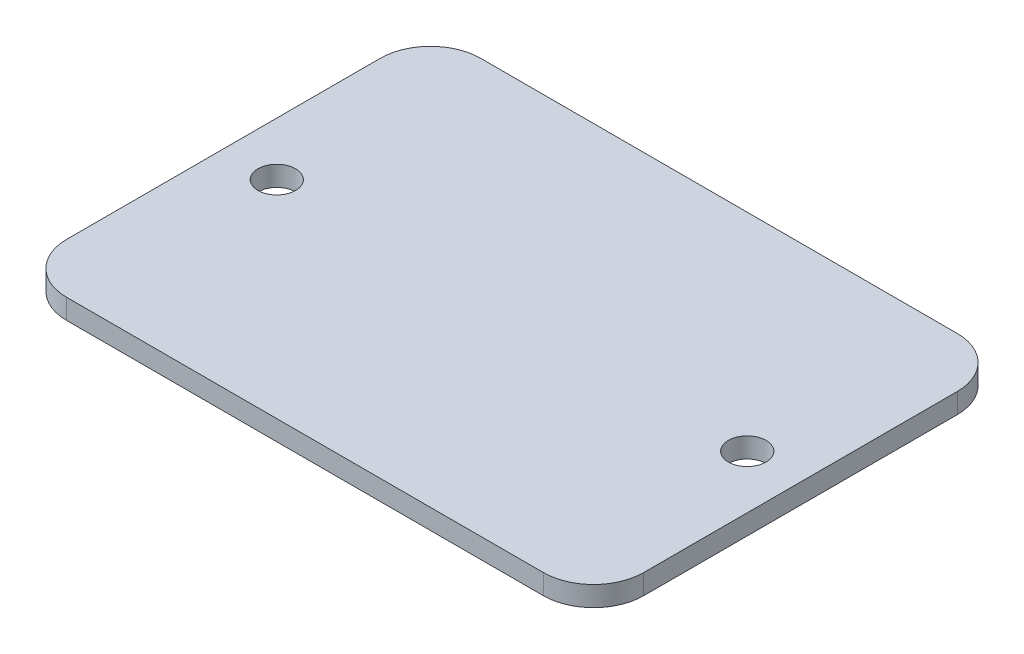
ISO-10303-21;
HEADER;
FILE_DESCRIPTION(('STEP AP214'),'2;1');
FILE_NAME('part.step','',(''),(''),'','','');
FILE_SCHEMA(('AUTOMOTIVE_DESIGN { 1 0 10303 214 1 1 1 1 }'));
ENDSEC;
DATA;
#1=APPLICATION_CONTEXT('core data for automotive mechanical design processes');
#2=APPLICATION_PROTOCOL_DEFINITION('international standard','automotive_design',2000,#1);
#3=PRODUCT_CONTEXT('',#1,'mechanical');
#4=PRODUCT('Part','Part','',(#3));
#5=PRODUCT_RELATED_PRODUCT_CATEGORY('part','',(#4));
#6=PRODUCT_DEFINITION_FORMATION('','',#4);
#7=PRODUCT_DEFINITION_CONTEXT('part definition',#1,'design');
#8=PRODUCT_DEFINITION('design','',#6,#7);
#9=PRODUCT_DEFINITION_SHAPE('','',#8);
#10=(LENGTH_UNIT() NAMED_UNIT(*) SI_UNIT(.MILLI.,.METRE.));
#11=(NAMED_UNIT(*) PLANE_ANGLE_UNIT() SI_UNIT($,.RADIAN.));
#12=(NAMED_UNIT(*) SI_UNIT($,.STERADIAN.) SOLID_ANGLE_UNIT());
#13=UNCERTAINTY_MEASURE_WITH_UNIT(LENGTH_MEASURE(1.E-05),#10,'distance_accuracy_value','');
#14=(GEOMETRIC_REPRESENTATION_CONTEXT(3) GLOBAL_UNCERTAINTY_ASSIGNED_CONTEXT((#13)) GLOBAL_UNIT_ASSIGNED_CONTEXT((#10,
#11,#12)) REPRESENTATION_CONTEXT('',''));
#15=CARTESIAN_POINT('',(0.,0.,0.));
#16=DIRECTION('',(0.,0.,1.));
#17=DIRECTION('',(1.,0.,0.));
#18=AXIS2_PLACEMENT_3D('',#15,#16,#17);
#19=CARTESIAN_POINT('',(0.,1.6,0.));
#20=DIRECTION('',(0.,-1.,0.));
#21=DIRECTION('',(0.,0.,-1.));
#22=AXIS2_PLACEMENT_3D('',#19,#20,#21);
#23=PLANE('',#22);
#24=DIRECTION('',(-1.,0.,0.));
#25=VECTOR('',#24,1.);
#26=CARTESIAN_POINT('',(-23.,1.6,-16.5));
#27=LINE('',#26,#25);
#28=CARTESIAN_POINT('',(19.,1.6,-16.5));
#29=VERTEX_POINT('',#28);
#30=CARTESIAN_POINT('',(-19.,1.6,-16.5));
#31=VERTEX_POINT('',#30);
#32=EDGE_CURVE('E201',#29,#31,#27,.T.);
#33=ORIENTED_EDGE('',*,*,#32,.T.);
#34=CARTESIAN_POINT('',(-19.,1.6,-12.5));
#35=DIRECTION('',(0.,-1.,0.));
#36=DIRECTION('',(0.,0.,-1.));
#37=AXIS2_PLACEMENT_3D('',#34,#35,#36);
#38=CIRCLE('',#37,4.);
#39=CARTESIAN_POINT('',(-23.,1.6,-12.5));
#40=VERTEX_POINT('',#39);
#41=EDGE_CURVE('E174',#31,#40,#38,.F.);
#42=ORIENTED_EDGE('',*,*,#41,.T.);
#43=DIRECTION('',(0.,0.,1.));
#44=VECTOR('',#43,1.);
#45=CARTESIAN_POINT('',(-23.,1.6,16.5));
#46=LINE('',#45,#44);
#47=CARTESIAN_POINT('',(-23.,1.6,12.5));
#48=VERTEX_POINT('',#47);
#49=EDGE_CURVE('E131',#40,#48,#46,.T.);
#50=ORIENTED_EDGE('',*,*,#49,.T.);
#51=CARTESIAN_POINT('',(-19.,1.6,12.5));
#52=DIRECTION('',(0.,-1.,0.));
#53=DIRECTION('',(0.,0.,-1.));
#54=AXIS2_PLACEMENT_3D('',#51,#52,#53);
#55=CIRCLE('',#54,4.);
#56=CARTESIAN_POINT('',(-19.,1.6,16.5));
#57=VERTEX_POINT('',#56);
#58=EDGE_CURVE('E66',#48,#57,#55,.F.);
#59=ORIENTED_EDGE('',*,*,#58,.T.);
#60=DIRECTION('',(1.,0.,0.));
#61=VECTOR('',#60,1.);
#62=CARTESIAN_POINT('',(-23.,1.6,16.5));
#63=LINE('',#62,#61);
#64=CARTESIAN_POINT('',(19.,1.6,16.5));
#65=VERTEX_POINT('',#64);
#66=EDGE_CURVE('E152',#57,#65,#63,.T.);
#67=ORIENTED_EDGE('',*,*,#66,.T.);
#68=CARTESIAN_POINT('',(19.,1.6,12.5));
#69=DIRECTION('',(0.,-1.,0.));
#70=DIRECTION('',(0.,0.,-1.));
#71=AXIS2_PLACEMENT_3D('',#68,#69,#70);
#72=CIRCLE('',#71,4.);
#73=CARTESIAN_POINT('',(23.,1.6,12.5));
#74=VERTEX_POINT('',#73);
#75=EDGE_CURVE('E168',#65,#74,#72,.F.);
#76=ORIENTED_EDGE('',*,*,#75,.T.);
#77=DIRECTION('',(0.,0.,-1.));
#78=VECTOR('',#77,1.);
#79=CARTESIAN_POINT('',(23.,1.6,16.5));
#80=LINE('',#79,#78);
#81=CARTESIAN_POINT('',(23.,1.6,-12.5));
#82=VERTEX_POINT('',#81);
#83=EDGE_CURVE('E145',#74,#82,#80,.T.);
#84=ORIENTED_EDGE('',*,*,#83,.T.);
#85=CARTESIAN_POINT('',(19.,1.6,-12.5));
#86=DIRECTION('',(0.,-1.,0.));
#87=DIRECTION('',(0.,0.,-1.));
#88=AXIS2_PLACEMENT_3D('',#85,#86,#87);
#89=CIRCLE('',#88,4.);
#90=EDGE_CURVE('E171',#82,#29,#89,.F.);
#91=ORIENTED_EDGE('',*,*,#90,.T.);
#92=EDGE_LOOP('',(#33,#42,#50,#59,#67,#76,#84,#91));
#93=FACE_BOUND('',#92,.T.);
#94=CARTESIAN_POINT('',(-18.75,1.6,0.));
#95=DIRECTION('',(0.,1.,0.));
#96=DIRECTION('',(0.,0.,1.));
#97=AXIS2_PLACEMENT_3D('',#94,#95,#96);
#98=CIRCLE('',#97,1.5);
#99=CARTESIAN_POINT('',(-18.75,1.6,1.5));
#100=VERTEX_POINT('',#99);
#101=EDGE_CURVE('E214',#100,#100,#98,.T.);
#102=ORIENTED_EDGE('',*,*,#101,.F.);
#103=EDGE_LOOP('',(#102));
#104=FACE_BOUND('',#103,.T.);
#105=CARTESIAN_POINT('',(18.75,1.6,0.));
#106=DIRECTION('',(0.,1.,0.));
#107=DIRECTION('',(0.,0.,-1.));
#108=AXIS2_PLACEMENT_3D('',#105,#106,#107);
#109=CIRCLE('',#108,1.5);
#110=CARTESIAN_POINT('',(18.75,1.6,-1.5));
#111=VERTEX_POINT('',#110);
#112=EDGE_CURVE('E221',#111,#111,#109,.T.);
#113=ORIENTED_EDGE('',*,*,#112,.F.);
#114=EDGE_LOOP('',(#113));
#115=FACE_BOUND('',#114,.T.);
#116=ADVANCED_FACE('F45',(#93,#104,#115),#23,.F.);
#117=CARTESIAN_POINT('',(0.,0.,0.));
#118=DIRECTION('',(0.,-1.,0.));
#119=DIRECTION('',(0.,0.,-1.));
#120=AXIS2_PLACEMENT_3D('',#117,#118,#119);
#121=PLANE('',#120);
#122=CARTESIAN_POINT('',(-18.75,0.,0.));
#123=DIRECTION('',(0.,1.,0.));
#124=DIRECTION('',(0.,0.,1.));
#125=AXIS2_PLACEMENT_3D('',#122,#123,#124);
#126=CIRCLE('',#125,1.5);
#127=CARTESIAN_POINT('',(-18.75,0.,1.5));
#128=VERTEX_POINT('',#127);
#129=EDGE_CURVE('E207',#128,#128,#126,.T.);
#130=ORIENTED_EDGE('',*,*,#129,.T.);
#131=EDGE_LOOP('',(#130));
#132=FACE_BOUND('',#131,.T.);
#133=DIRECTION('',(0.,0.,1.));
#134=VECTOR('',#133,1.);
#135=CARTESIAN_POINT('',(-23.,0.,16.5));
#136=LINE('',#135,#134);
#137=CARTESIAN_POINT('',(-23.,0.,-12.5));
#138=VERTEX_POINT('',#137);
#139=CARTESIAN_POINT('',(-23.,0.,12.5));
#140=VERTEX_POINT('',#139);
#141=EDGE_CURVE('E129',#138,#140,#136,.T.);
#142=ORIENTED_EDGE('',*,*,#141,.F.);
#143=CARTESIAN_POINT('',(-19.,0.,-12.5));
#144=DIRECTION('',(0.,-1.,0.));
#145=DIRECTION('',(0.,0.,-1.));
#146=AXIS2_PLACEMENT_3D('',#143,#144,#145);
#147=CIRCLE('',#146,4.);
#148=CARTESIAN_POINT('',(-19.,0.,-16.5));
#149=VERTEX_POINT('',#148);
#150=EDGE_CURVE('E111',#138,#149,#147,.T.);
#151=ORIENTED_EDGE('',*,*,#150,.T.);
#152=DIRECTION('',(-1.,0.,0.));
#153=VECTOR('',#152,1.);
#154=CARTESIAN_POINT('',(-23.,0.,-16.5));
#155=LINE('',#154,#153);
#156=CARTESIAN_POINT('',(19.,0.,-16.5));
#157=VERTEX_POINT('',#156);
#158=EDGE_CURVE('E141',#157,#149,#155,.T.);
#159=ORIENTED_EDGE('',*,*,#158,.F.);
#160=CARTESIAN_POINT('',(19.,0.,-12.5));
#161=DIRECTION('',(0.,-1.,0.));
#162=DIRECTION('',(0.,0.,-1.));
#163=AXIS2_PLACEMENT_3D('',#160,#161,#162);
#164=CIRCLE('',#163,4.);
#165=CARTESIAN_POINT('',(23.,0.,-12.5));
#166=VERTEX_POINT('',#165);
#167=EDGE_CURVE('E123',#157,#166,#164,.T.);
#168=ORIENTED_EDGE('',*,*,#167,.T.);
#169=DIRECTION('',(0.,0.,-1.));
#170=VECTOR('',#169,1.);
#171=CARTESIAN_POINT('',(23.,0.,16.5));
#172=LINE('',#171,#170);
#173=CARTESIAN_POINT('',(23.,0.,12.5));
#174=VERTEX_POINT('',#173);
#175=EDGE_CURVE('E147',#174,#166,#172,.T.);
#176=ORIENTED_EDGE('',*,*,#175,.F.);
#177=CARTESIAN_POINT('',(19.,0.,12.5));
#178=DIRECTION('',(0.,-1.,0.));
#179=DIRECTION('',(0.,0.,-1.));
#180=AXIS2_PLACEMENT_3D('',#177,#178,#179);
#181=CIRCLE('',#180,4.);
#182=CARTESIAN_POINT('',(19.,0.,16.5));
#183=VERTEX_POINT('',#182);
#184=EDGE_CURVE('E156',#174,#183,#181,.T.);
#185=ORIENTED_EDGE('',*,*,#184,.T.);
#186=DIRECTION('',(1.,0.,0.));
#187=VECTOR('',#186,1.);
#188=CARTESIAN_POINT('',(-23.,0.,16.5));
#189=LINE('',#188,#187);
#190=CARTESIAN_POINT('',(-19.,0.,16.5));
#191=VERTEX_POINT('',#190);
#192=EDGE_CURVE('E140',#191,#183,#189,.T.);
#193=ORIENTED_EDGE('',*,*,#192,.F.);
#194=CARTESIAN_POINT('',(-19.,0.,12.5));
#195=DIRECTION('',(0.,-1.,0.));
#196=DIRECTION('',(0.,0.,-1.));
#197=AXIS2_PLACEMENT_3D('',#194,#195,#196);
#198=CIRCLE('',#197,4.);
#199=EDGE_CURVE('E133',#191,#140,#198,.T.);
#200=ORIENTED_EDGE('',*,*,#199,.T.);
#201=EDGE_LOOP('',(#142,#151,#159,#168,#176,#185,#193,#200));
#202=FACE_BOUND('',#201,.T.);
#203=CARTESIAN_POINT('',(18.75,0.,0.));
#204=DIRECTION('',(0.,1.,0.));
#205=DIRECTION('',(0.,0.,-1.));
#206=AXIS2_PLACEMENT_3D('',#203,#204,#205);
#207=CIRCLE('',#206,1.5);
#208=CARTESIAN_POINT('',(18.75,0.,-1.5));
#209=VERTEX_POINT('',#208);
#210=EDGE_CURVE('E223',#209,#209,#207,.T.);
#211=ORIENTED_EDGE('',*,*,#210,.T.);
#212=EDGE_LOOP('',(#211));
#213=FACE_BOUND('',#212,.T.);
#214=ADVANCED_FACE('F136',(#132,#202,#213),#121,.T.);
#215=CARTESIAN_POINT('',(23.,1.6,16.5));
#216=DIRECTION('',(-1.,0.,0.));
#217=DIRECTION('',(0.,0.,1.));
#218=AXIS2_PLACEMENT_3D('',#215,#216,#217);
#219=PLANE('',#218);
#220=ORIENTED_EDGE('',*,*,#175,.T.);
#221=DIRECTION('',(0.,-1.,0.));
#222=VECTOR('',#221,1.);
#223=CARTESIAN_POINT('',(23.,1.6,-12.5));
#224=LINE('',#223,#222);
#225=EDGE_CURVE('E181',#166,#82,#224,.F.);
#226=ORIENTED_EDGE('',*,*,#225,.T.);
#227=ORIENTED_EDGE('',*,*,#83,.F.);
#228=DIRECTION('',(0.,-1.,0.));
#229=VECTOR('',#228,1.);
#230=CARTESIAN_POINT('',(23.,1.6,12.5));
#231=LINE('',#230,#229);
#232=EDGE_CURVE('E177',#74,#174,#231,.T.);
#233=ORIENTED_EDGE('',*,*,#232,.T.);
#234=EDGE_LOOP('',(#220,#226,#227,#233));
#235=FACE_BOUND('',#234,.T.);
#236=ADVANCED_FACE('F196',(#235),#219,.F.);
#237=CARTESIAN_POINT('',(-23.,1.6,-16.5));
#238=DIRECTION('',(0.,0.,1.));
#239=DIRECTION('',(1.,0.,0.));
#240=AXIS2_PLACEMENT_3D('',#237,#238,#239);
#241=PLANE('',#240);
#242=ORIENTED_EDGE('',*,*,#158,.T.);
#243=DIRECTION('',(0.,-1.,0.));
#244=VECTOR('',#243,1.);
#245=CARTESIAN_POINT('',(-19.,1.6,-16.5));
#246=LINE('',#245,#244);
#247=EDGE_CURVE('E116',#149,#31,#246,.F.);
#248=ORIENTED_EDGE('',*,*,#247,.T.);
#249=ORIENTED_EDGE('',*,*,#32,.F.);
#250=DIRECTION('',(0.,-1.,0.));
#251=VECTOR('',#250,1.);
#252=CARTESIAN_POINT('',(19.,1.6,-16.5));
#253=LINE('',#252,#251);
#254=EDGE_CURVE('E122',#29,#157,#253,.T.);
#255=ORIENTED_EDGE('',*,*,#254,.T.);
#256=EDGE_LOOP('',(#242,#248,#249,#255));
#257=FACE_BOUND('',#256,.T.);
#258=ADVANCED_FACE('F251',(#257),#241,.F.);
#259=CARTESIAN_POINT('',(-23.,1.6,16.5));
#260=DIRECTION('',(1.,0.,0.));
#261=DIRECTION('',(0.,0.,-1.));
#262=AXIS2_PLACEMENT_3D('',#259,#260,#261);
#263=PLANE('',#262);
#264=ORIENTED_EDGE('',*,*,#49,.F.);
#265=DIRECTION('',(0.,-1.,0.));
#266=VECTOR('',#265,1.);
#267=CARTESIAN_POINT('',(-23.,1.6,-12.5));
#268=LINE('',#267,#266);
#269=EDGE_CURVE('E115',#40,#138,#268,.T.);
#270=ORIENTED_EDGE('',*,*,#269,.T.);
#271=ORIENTED_EDGE('',*,*,#141,.T.);
#272=DIRECTION('',(0.,-1.,0.));
#273=VECTOR('',#272,1.);
#274=CARTESIAN_POINT('',(-23.,1.6,12.5));
#275=LINE('',#274,#273);
#276=EDGE_CURVE('E134',#140,#48,#275,.F.);
#277=ORIENTED_EDGE('',*,*,#276,.T.);
#278=EDGE_LOOP('',(#264,#270,#271,#277));
#279=FACE_BOUND('',#278,.T.);
#280=ADVANCED_FACE('F128',(#279),#263,.F.);
#281=CARTESIAN_POINT('',(-23.,1.6,16.5));
#282=DIRECTION('',(0.,0.,-1.));
#283=DIRECTION('',(-1.,0.,0.));
#284=AXIS2_PLACEMENT_3D('',#281,#282,#283);
#285=PLANE('',#284);
#286=ORIENTED_EDGE('',*,*,#192,.T.);
#287=DIRECTION('',(0.,-1.,0.));
#288=VECTOR('',#287,1.);
#289=CARTESIAN_POINT('',(19.,1.6,16.5));
#290=LINE('',#289,#288);
#291=EDGE_CURVE('E11',#183,#65,#290,.F.);
#292=ORIENTED_EDGE('',*,*,#291,.T.);
#293=ORIENTED_EDGE('',*,*,#66,.F.);
#294=DIRECTION('',(0.,-1.,0.));
#295=VECTOR('',#294,1.);
#296=CARTESIAN_POINT('',(-19.,1.6,16.5));
#297=LINE('',#296,#295);
#298=EDGE_CURVE('E54',#57,#191,#297,.T.);
#299=ORIENTED_EDGE('',*,*,#298,.T.);
#300=EDGE_LOOP('',(#286,#292,#293,#299));
#301=FACE_BOUND('',#300,.T.);
#302=ADVANCED_FACE('F186',(#301),#285,.F.);
#303=CARTESIAN_POINT('',(-18.75,1.6,0.));
#304=DIRECTION('',(0.,-1.,0.));
#305=DIRECTION('',(0.,0.,-1.));
#306=AXIS2_PLACEMENT_3D('',#303,#304,#305);
#307=CYLINDRICAL_SURFACE('',#306,1.5);
#308=ORIENTED_EDGE('',*,*,#101,.T.);
#309=EDGE_LOOP('',(#308));
#310=FACE_BOUND('',#309,.T.);
#311=ORIENTED_EDGE('',*,*,#129,.F.);
#312=EDGE_LOOP('',(#311));
#313=FACE_BOUND('',#312,.T.);
#314=ADVANCED_FACE('F244',(#310,#313),#307,.F.);
#315=CARTESIAN_POINT('',(18.75,1.6,0.));
#316=DIRECTION('',(0.,-1.,0.));
#317=DIRECTION('',(0.,0.,-1.));
#318=AXIS2_PLACEMENT_3D('',#315,#316,#317);
#319=CYLINDRICAL_SURFACE('',#318,1.5);
#320=ORIENTED_EDGE('',*,*,#112,.T.);
#321=EDGE_LOOP('',(#320));
#322=FACE_BOUND('',#321,.T.);
#323=ORIENTED_EDGE('',*,*,#210,.F.);
#324=EDGE_LOOP('',(#323));
#325=FACE_BOUND('',#324,.T.);
#326=ADVANCED_FACE('F231',(#322,#325),#319,.F.);
#327=CARTESIAN_POINT('',(-19.,1.6,-12.5));
#328=DIRECTION('',(0.,-1.,0.));
#329=DIRECTION('',(0.,0.,-1.));
#330=AXIS2_PLACEMENT_3D('',#327,#328,#329);
#331=CYLINDRICAL_SURFACE('',#330,4.);
#332=ORIENTED_EDGE('',*,*,#41,.F.);
#333=ORIENTED_EDGE('',*,*,#247,.F.);
#334=ORIENTED_EDGE('',*,*,#150,.F.);
#335=ORIENTED_EDGE('',*,*,#269,.F.);
#336=EDGE_LOOP('',(#332,#333,#334,#335));
#337=FACE_BOUND('',#336,.T.);
#338=ADVANCED_FACE('F114',(#337),#331,.T.);
#339=CARTESIAN_POINT('',(19.,1.6,-12.5));
#340=DIRECTION('',(0.,-1.,0.));
#341=DIRECTION('',(0.,0.,-1.));
#342=AXIS2_PLACEMENT_3D('',#339,#340,#341);
#343=CYLINDRICAL_SURFACE('',#342,4.);
#344=ORIENTED_EDGE('',*,*,#90,.F.);
#345=ORIENTED_EDGE('',*,*,#225,.F.);
#346=ORIENTED_EDGE('',*,*,#167,.F.);
#347=ORIENTED_EDGE('',*,*,#254,.F.);
#348=EDGE_LOOP('',(#344,#345,#346,#347));
#349=FACE_BOUND('',#348,.T.);
#350=ADVANCED_FACE('F259',(#349),#343,.T.);
#351=CARTESIAN_POINT('',(19.,1.6,12.5));
#352=DIRECTION('',(0.,-1.,0.));
#353=DIRECTION('',(0.,0.,-1.));
#354=AXIS2_PLACEMENT_3D('',#351,#352,#353);
#355=CYLINDRICAL_SURFACE('',#354,4.);
#356=ORIENTED_EDGE('',*,*,#75,.F.);
#357=ORIENTED_EDGE('',*,*,#291,.F.);
#358=ORIENTED_EDGE('',*,*,#184,.F.);
#359=ORIENTED_EDGE('',*,*,#232,.F.);
#360=EDGE_LOOP('',(#356,#357,#358,#359));
#361=FACE_BOUND('',#360,.T.);
#362=ADVANCED_FACE('F193',(#361),#355,.T.);
#363=CARTESIAN_POINT('',(-19.,1.6,12.5));
#364=DIRECTION('',(0.,-1.,0.));
#365=DIRECTION('',(0.,0.,-1.));
#366=AXIS2_PLACEMENT_3D('',#363,#364,#365);
#367=CYLINDRICAL_SURFACE('',#366,4.);
#368=ORIENTED_EDGE('',*,*,#58,.F.);
#369=ORIENTED_EDGE('',*,*,#276,.F.);
#370=ORIENTED_EDGE('',*,*,#199,.F.);
#371=ORIENTED_EDGE('',*,*,#298,.F.);
#372=EDGE_LOOP('',(#368,#369,#370,#371));
#373=FACE_BOUND('',#372,.T.);
#374=ADVANCED_FACE('F47',(#373),#367,.T.);
#375=CLOSED_SHELL('',(#116,#214,#236,#258,#280,#302,#314,#326,#338,#350,#362,#374));
#376=MANIFOLD_SOLID_BREP('B2',#375);
#377=ADVANCED_BREP_SHAPE_REPRESENTATION('',(#18,#376),#14);
#378=SHAPE_DEFINITION_REPRESENTATION(#9,#377);
ENDSEC;
END-ISO-10303-21;
